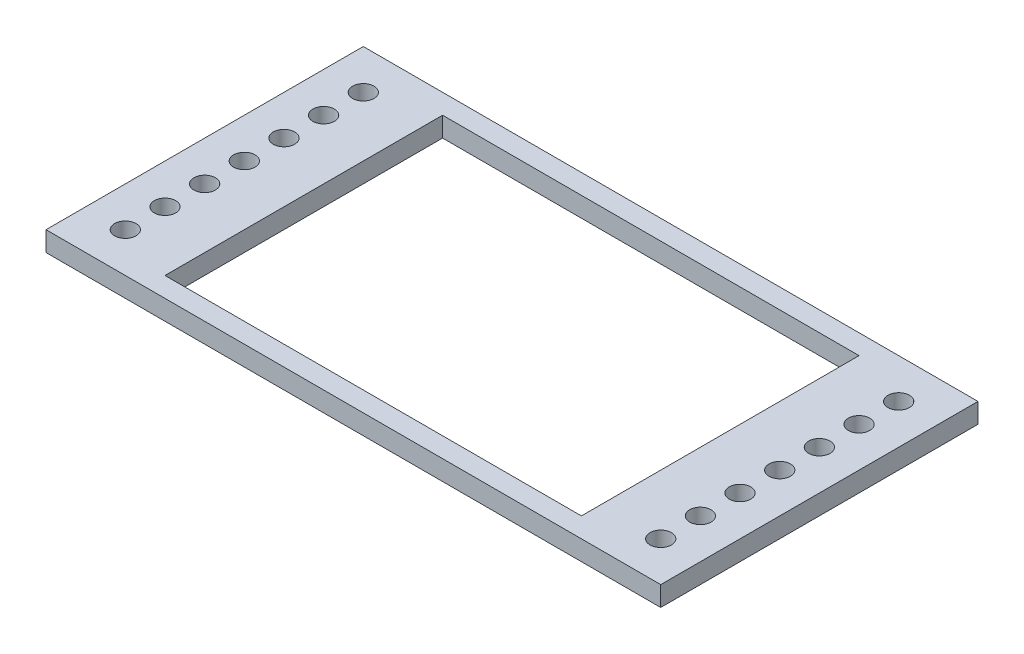
ISO-10303-21;
HEADER;
FILE_DESCRIPTION(('STEP AP214'),'2;1');
FILE_NAME('part.step','',(''),(''),'','','');
FILE_SCHEMA(('AUTOMOTIVE_DESIGN { 1 0 10303 214 1 1 1 1 }'));
ENDSEC;
DATA;
#1=APPLICATION_CONTEXT('core data for automotive mechanical design processes');
#2=APPLICATION_PROTOCOL_DEFINITION('international standard','automotive_design',2000,#1);
#3=PRODUCT_CONTEXT('',#1,'mechanical');
#4=PRODUCT('Part','Part','',(#3));
#5=PRODUCT_RELATED_PRODUCT_CATEGORY('part','',(#4));
#6=PRODUCT_DEFINITION_FORMATION('','',#4);
#7=PRODUCT_DEFINITION_CONTEXT('part definition',#1,'design');
#8=PRODUCT_DEFINITION('design','',#6,#7);
#9=PRODUCT_DEFINITION_SHAPE('','',#8);
#10=(LENGTH_UNIT() NAMED_UNIT(*) SI_UNIT(.MILLI.,.METRE.));
#11=(NAMED_UNIT(*) PLANE_ANGLE_UNIT() SI_UNIT($,.RADIAN.));
#12=(NAMED_UNIT(*) SI_UNIT($,.STERADIAN.) SOLID_ANGLE_UNIT());
#13=UNCERTAINTY_MEASURE_WITH_UNIT(LENGTH_MEASURE(1.E-05),#10,'distance_accuracy_value','');
#14=(GEOMETRIC_REPRESENTATION_CONTEXT(3) GLOBAL_UNCERTAINTY_ASSIGNED_CONTEXT((#13)) GLOBAL_UNIT_ASSIGNED_CONTEXT((#10,
#11,#12)) REPRESENTATION_CONTEXT('',''));
#15=CARTESIAN_POINT('',(0.,0.,0.));
#16=DIRECTION('',(0.,0.,1.));
#17=DIRECTION('',(1.,0.,0.));
#18=AXIS2_PLACEMENT_3D('',#15,#16,#17);
#19=CARTESIAN_POINT('',(0.,6.35,0.));
#20=DIRECTION('',(0.,-1.,0.));
#21=DIRECTION('',(0.,0.,-1.));
#22=AXIS2_PLACEMENT_3D('',#19,#20,#21);
#23=PLANE('',#22);
#24=DIRECTION('',(0.,0.,-1.));
#25=VECTOR('',#24,1.);
#26=CARTESIAN_POINT('',(98.425,6.35,50.8));
#27=LINE('',#26,#25);
#28=CARTESIAN_POINT('',(98.425,6.35,50.8));
#29=VERTEX_POINT('',#28);
#30=CARTESIAN_POINT('',(98.425,6.35,-50.8));
#31=VERTEX_POINT('',#30);
#32=EDGE_CURVE('E139',#29,#31,#27,.T.);
#33=ORIENTED_EDGE('',*,*,#32,.T.);
#34=DIRECTION('',(-1.,0.,0.));
#35=VECTOR('',#34,1.);
#36=CARTESIAN_POINT('',(-98.425,6.35,-50.8));
#37=LINE('',#36,#35);
#38=CARTESIAN_POINT('',(-98.425,6.35,-50.8));
#39=VERTEX_POINT('',#38);
#40=EDGE_CURVE('E142',#31,#39,#37,.T.);
#41=ORIENTED_EDGE('',*,*,#40,.T.);
#42=DIRECTION('',(0.,0.,1.));
#43=VECTOR('',#42,1.);
#44=CARTESIAN_POINT('',(-98.425,6.35,50.8));
#45=LINE('',#44,#43);
#46=CARTESIAN_POINT('',(-98.425,6.35,50.8));
#47=VERTEX_POINT('',#46);
#48=EDGE_CURVE('E145',#39,#47,#45,.T.);
#49=ORIENTED_EDGE('',*,*,#48,.T.);
#50=DIRECTION('',(1.,0.,0.));
#51=VECTOR('',#50,1.);
#52=CARTESIAN_POINT('',(-98.425,6.35,50.8));
#53=LINE('',#52,#51);
#54=EDGE_CURVE('E147',#47,#29,#53,.T.);
#55=ORIENTED_EDGE('',*,*,#54,.T.);
#56=EDGE_LOOP('',(#33,#41,#49,#55));
#57=FACE_BOUND('',#56,.T.);
#58=DIRECTION('',(0.,0.,-1.));
#59=VECTOR('',#58,1.);
#60=CARTESIAN_POINT('',(66.675,6.35,44.45));
#61=LINE('',#60,#59);
#62=CARTESIAN_POINT('',(66.675,6.35,44.45));
#63=VERTEX_POINT('',#62);
#64=CARTESIAN_POINT('',(66.675,6.35,-44.45));
#65=VERTEX_POINT('',#64);
#66=EDGE_CURVE('E100',#63,#65,#61,.T.);
#67=ORIENTED_EDGE('',*,*,#66,.F.);
#68=DIRECTION('',(1.,0.,0.));
#69=VECTOR('',#68,1.);
#70=CARTESIAN_POINT('',(-66.675,6.35,44.45));
#71=LINE('',#70,#69);
#72=CARTESIAN_POINT('',(-66.675,6.35,44.45));
#73=VERTEX_POINT('',#72);
#74=EDGE_CURVE('E123',#73,#63,#71,.T.);
#75=ORIENTED_EDGE('',*,*,#74,.F.);
#76=DIRECTION('',(0.,0.,1.));
#77=VECTOR('',#76,1.);
#78=CARTESIAN_POINT('',(-66.675,6.35,44.45));
#79=LINE('',#78,#77);
#80=CARTESIAN_POINT('',(-66.675,6.35,-44.45));
#81=VERTEX_POINT('',#80);
#82=EDGE_CURVE('E121',#81,#73,#79,.T.);
#83=ORIENTED_EDGE('',*,*,#82,.F.);
#84=DIRECTION('',(-1.,0.,0.));
#85=VECTOR('',#84,1.);
#86=CARTESIAN_POINT('',(-66.675,6.35,-44.45));
#87=LINE('',#86,#85);
#88=EDGE_CURVE('E108',#65,#81,#87,.T.);
#89=ORIENTED_EDGE('',*,*,#88,.F.);
#90=EDGE_LOOP('',(#67,#75,#83,#89));
#91=FACE_BOUND('',#90,.T.);
#92=CARTESIAN_POINT('',(-85.725,6.35,-38.1));
#93=DIRECTION('',(0.,1.,0.));
#94=DIRECTION('',(0.,0.,1.));
#95=AXIS2_PLACEMENT_3D('',#92,#93,#94);
#96=CIRCLE('',#95,3.429);
#97=CARTESIAN_POINT('',(-85.725,6.35,-34.671));
#98=VERTEX_POINT('',#97);
#99=EDGE_CURVE('E129',#98,#98,#96,.T.);
#100=ORIENTED_EDGE('',*,*,#99,.F.);
#101=EDGE_LOOP('',(#100));
#102=FACE_BOUND('',#101,.T.);
#103=CARTESIAN_POINT('',(85.725,6.35,-38.1));
#104=DIRECTION('',(0.,1.,0.));
#105=DIRECTION('',(0.,0.,1.));
#106=AXIS2_PLACEMENT_3D('',#103,#104,#105);
#107=CIRCLE('',#106,3.429);
#108=CARTESIAN_POINT('',(85.725,6.35,-34.671));
#109=VERTEX_POINT('',#108);
#110=EDGE_CURVE('E351',#109,#109,#107,.T.);
#111=ORIENTED_EDGE('',*,*,#110,.F.);
#112=EDGE_LOOP('',(#111));
#113=FACE_BOUND('',#112,.T.);
#114=CARTESIAN_POINT('',(85.7250000000001,6.35,-25.4));
#115=DIRECTION('',(0.,1.,0.));
#116=DIRECTION('',(0.,0.,1.));
#117=AXIS2_PLACEMENT_3D('',#114,#115,#116);
#118=CIRCLE('',#117,3.429);
#119=CARTESIAN_POINT('',(85.7250000000001,6.35,-21.971));
#120=VERTEX_POINT('',#119);
#121=EDGE_CURVE('E345',#120,#120,#118,.T.);
#122=ORIENTED_EDGE('',*,*,#121,.F.);
#123=EDGE_LOOP('',(#122));
#124=FACE_BOUND('',#123,.T.);
#125=CARTESIAN_POINT('',(85.7250000000003,6.35,-12.7));
#126=DIRECTION('',(0.,1.,0.));
#127=DIRECTION('',(0.,0.,1.));
#128=AXIS2_PLACEMENT_3D('',#125,#126,#127);
#129=CIRCLE('',#128,3.429);
#130=CARTESIAN_POINT('',(85.7250000000003,6.35,-9.27100000000001));
#131=VERTEX_POINT('',#130);
#132=EDGE_CURVE('E339',#131,#131,#129,.T.);
#133=ORIENTED_EDGE('',*,*,#132,.F.);
#134=EDGE_LOOP('',(#133));
#135=FACE_BOUND('',#134,.T.);
#136=CARTESIAN_POINT('',(85.7250000000004,6.35,0.));
#137=DIRECTION('',(0.,1.,0.));
#138=DIRECTION('',(0.,0.,1.));
#139=AXIS2_PLACEMENT_3D('',#136,#137,#138);
#140=CIRCLE('',#139,3.429);
#141=CARTESIAN_POINT('',(85.7250000000004,6.35,3.42899999999999));
#142=VERTEX_POINT('',#141);
#143=EDGE_CURVE('E333',#142,#142,#140,.T.);
#144=ORIENTED_EDGE('',*,*,#143,.F.);
#145=EDGE_LOOP('',(#144));
#146=FACE_BOUND('',#145,.T.);
#147=CARTESIAN_POINT('',(85.7250000000005,6.35,12.7));
#148=DIRECTION('',(0.,1.,0.));
#149=DIRECTION('',(0.,0.,1.));
#150=AXIS2_PLACEMENT_3D('',#147,#148,#149);
#151=CIRCLE('',#150,3.429);
#152=CARTESIAN_POINT('',(85.7250000000005,6.35,16.129));
#153=VERTEX_POINT('',#152);
#154=EDGE_CURVE('E327',#153,#153,#151,.T.);
#155=ORIENTED_EDGE('',*,*,#154,.F.);
#156=EDGE_LOOP('',(#155));
#157=FACE_BOUND('',#156,.T.);
#158=CARTESIAN_POINT('',(85.7250000000006,6.35,25.4));
#159=DIRECTION('',(0.,1.,0.));
#160=DIRECTION('',(0.,0.,1.));
#161=AXIS2_PLACEMENT_3D('',#158,#159,#160);
#162=CIRCLE('',#161,3.429);
#163=CARTESIAN_POINT('',(85.7250000000006,6.35,28.829));
#164=VERTEX_POINT('',#163);
#165=EDGE_CURVE('E321',#164,#164,#162,.T.);
#166=ORIENTED_EDGE('',*,*,#165,.F.);
#167=EDGE_LOOP('',(#166));
#168=FACE_BOUND('',#167,.T.);
#169=CARTESIAN_POINT('',(85.7250000000008,6.35,38.1));
#170=DIRECTION('',(0.,1.,0.));
#171=DIRECTION('',(0.,0.,1.));
#172=AXIS2_PLACEMENT_3D('',#169,#170,#171);
#173=CIRCLE('',#172,3.429);
#174=CARTESIAN_POINT('',(85.7250000000008,6.35,41.529));
#175=VERTEX_POINT('',#174);
#176=EDGE_CURVE('E315',#175,#175,#173,.T.);
#177=ORIENTED_EDGE('',*,*,#176,.F.);
#178=EDGE_LOOP('',(#177));
#179=FACE_BOUND('',#178,.T.);
#180=CARTESIAN_POINT('',(-85.7249999999999,6.35,-25.4));
#181=DIRECTION('',(0.,1.,0.));
#182=DIRECTION('',(0.,0.,1.));
#183=AXIS2_PLACEMENT_3D('',#180,#181,#182);
#184=CIRCLE('',#183,3.429);
#185=CARTESIAN_POINT('',(-85.7249999999999,6.35,-21.971));
#186=VERTEX_POINT('',#185);
#187=EDGE_CURVE('E309',#186,#186,#184,.T.);
#188=ORIENTED_EDGE('',*,*,#187,.F.);
#189=EDGE_LOOP('',(#188));
#190=FACE_BOUND('',#189,.T.);
#191=CARTESIAN_POINT('',(-85.7249999999998,6.35,-12.7));
#192=DIRECTION('',(0.,1.,0.));
#193=DIRECTION('',(0.,0.,1.));
#194=AXIS2_PLACEMENT_3D('',#191,#192,#193);
#195=CIRCLE('',#194,3.429);
#196=CARTESIAN_POINT('',(-85.7249999999998,6.35,-9.27100000000001));
#197=VERTEX_POINT('',#196);
#198=EDGE_CURVE('E303',#197,#197,#195,.T.);
#199=ORIENTED_EDGE('',*,*,#198,.F.);
#200=EDGE_LOOP('',(#199));
#201=FACE_BOUND('',#200,.T.);
#202=CARTESIAN_POINT('',(-85.7249999999996,6.35,0.));
#203=DIRECTION('',(0.,1.,0.));
#204=DIRECTION('',(0.,0.,1.));
#205=AXIS2_PLACEMENT_3D('',#202,#203,#204);
#206=CIRCLE('',#205,3.429);
#207=CARTESIAN_POINT('',(-85.7249999999996,6.35,3.42899999999999));
#208=VERTEX_POINT('',#207);
#209=EDGE_CURVE('E297',#208,#208,#206,.T.);
#210=ORIENTED_EDGE('',*,*,#209,.F.);
#211=EDGE_LOOP('',(#210));
#212=FACE_BOUND('',#211,.T.);
#213=CARTESIAN_POINT('',(-85.7249999999995,6.35,12.7));
#214=DIRECTION('',(0.,1.,0.));
#215=DIRECTION('',(0.,0.,1.));
#216=AXIS2_PLACEMENT_3D('',#213,#214,#215);
#217=CIRCLE('',#216,3.429);
#218=CARTESIAN_POINT('',(-85.7249999999995,6.35,16.129));
#219=VERTEX_POINT('',#218);
#220=EDGE_CURVE('E291',#219,#219,#217,.T.);
#221=ORIENTED_EDGE('',*,*,#220,.F.);
#222=EDGE_LOOP('',(#221));
#223=FACE_BOUND('',#222,.T.);
#224=CARTESIAN_POINT('',(-85.7249999999993,6.35,25.4));
#225=DIRECTION('',(0.,1.,0.));
#226=DIRECTION('',(0.,0.,1.));
#227=AXIS2_PLACEMENT_3D('',#224,#225,#226);
#228=CIRCLE('',#227,3.429);
#229=CARTESIAN_POINT('',(-85.7249999999993,6.35,28.829));
#230=VERTEX_POINT('',#229);
#231=EDGE_CURVE('E285',#230,#230,#228,.T.);
#232=ORIENTED_EDGE('',*,*,#231,.F.);
#233=EDGE_LOOP('',(#232));
#234=FACE_BOUND('',#233,.T.);
#235=CARTESIAN_POINT('',(-85.7249999999992,6.35,38.1));
#236=DIRECTION('',(0.,1.,0.));
#237=DIRECTION('',(0.,0.,1.));
#238=AXIS2_PLACEMENT_3D('',#235,#236,#237);
#239=CIRCLE('',#238,3.429);
#240=CARTESIAN_POINT('',(-85.7249999999992,6.35,41.529));
#241=VERTEX_POINT('',#240);
#242=EDGE_CURVE('E276',#241,#241,#239,.T.);
#243=ORIENTED_EDGE('',*,*,#242,.F.);
#244=EDGE_LOOP('',(#243));
#245=FACE_BOUND('',#244,.T.);
#246=ADVANCED_FACE('F35',(#57,#91,#102,#113,#124,#135,#146,#157,#168,#179,#190,#201,#212,#223,
#234,#245),#23,.F.);
#247=CARTESIAN_POINT('',(0.,0.,0.));
#248=DIRECTION('',(0.,-1.,0.));
#249=DIRECTION('',(0.,0.,-1.));
#250=AXIS2_PLACEMENT_3D('',#247,#248,#249);
#251=PLANE('',#250);
#252=CARTESIAN_POINT('',(-85.7249999999993,0.,25.4));
#253=DIRECTION('',(0.,1.,0.));
#254=DIRECTION('',(0.,0.,1.));
#255=AXIS2_PLACEMENT_3D('',#252,#253,#254);
#256=CIRCLE('',#255,3.429);
#257=CARTESIAN_POINT('',(-85.7249999999993,0.,28.829));
#258=VERTEX_POINT('',#257);
#259=EDGE_CURVE('E282',#258,#258,#256,.T.);
#260=ORIENTED_EDGE('',*,*,#259,.T.);
#261=EDGE_LOOP('',(#260));
#262=FACE_BOUND('',#261,.T.);
#263=CARTESIAN_POINT('',(-85.7249999999996,0.,0.));
#264=DIRECTION('',(0.,1.,0.));
#265=DIRECTION('',(0.,0.,1.));
#266=AXIS2_PLACEMENT_3D('',#263,#264,#265);
#267=CIRCLE('',#266,3.429);
#268=CARTESIAN_POINT('',(-85.7249999999996,0.,3.42899999999999));
#269=VERTEX_POINT('',#268);
#270=EDGE_CURVE('E294',#269,#269,#267,.T.);
#271=ORIENTED_EDGE('',*,*,#270,.T.);
#272=EDGE_LOOP('',(#271));
#273=FACE_BOUND('',#272,.T.);
#274=CARTESIAN_POINT('',(-85.7249999999999,0.,-25.4));
#275=DIRECTION('',(0.,1.,0.));
#276=DIRECTION('',(0.,0.,1.));
#277=AXIS2_PLACEMENT_3D('',#274,#275,#276);
#278=CIRCLE('',#277,3.429);
#279=CARTESIAN_POINT('',(-85.7249999999999,0.,-21.971));
#280=VERTEX_POINT('',#279);
#281=EDGE_CURVE('E306',#280,#280,#278,.T.);
#282=ORIENTED_EDGE('',*,*,#281,.T.);
#283=EDGE_LOOP('',(#282));
#284=FACE_BOUND('',#283,.T.);
#285=CARTESIAN_POINT('',(85.7250000000006,0.,25.4));
#286=DIRECTION('',(0.,1.,0.));
#287=DIRECTION('',(0.,0.,1.));
#288=AXIS2_PLACEMENT_3D('',#285,#286,#287);
#289=CIRCLE('',#288,3.429);
#290=CARTESIAN_POINT('',(85.7250000000006,0.,28.829));
#291=VERTEX_POINT('',#290);
#292=EDGE_CURVE('E318',#291,#291,#289,.T.);
#293=ORIENTED_EDGE('',*,*,#292,.T.);
#294=EDGE_LOOP('',(#293));
#295=FACE_BOUND('',#294,.T.);
#296=CARTESIAN_POINT('',(85.7250000000004,0.,0.));
#297=DIRECTION('',(0.,1.,0.));
#298=DIRECTION('',(0.,0.,1.));
#299=AXIS2_PLACEMENT_3D('',#296,#297,#298);
#300=CIRCLE('',#299,3.429);
#301=CARTESIAN_POINT('',(85.7250000000004,0.,3.42899999999999));
#302=VERTEX_POINT('',#301);
#303=EDGE_CURVE('E330',#302,#302,#300,.T.);
#304=ORIENTED_EDGE('',*,*,#303,.T.);
#305=EDGE_LOOP('',(#304));
#306=FACE_BOUND('',#305,.T.);
#307=CARTESIAN_POINT('',(85.7250000000001,0.,-25.4));
#308=DIRECTION('',(0.,1.,0.));
#309=DIRECTION('',(0.,0.,1.));
#310=AXIS2_PLACEMENT_3D('',#307,#308,#309);
#311=CIRCLE('',#310,3.429);
#312=CARTESIAN_POINT('',(85.7250000000001,0.,-21.971));
#313=VERTEX_POINT('',#312);
#314=EDGE_CURVE('E342',#313,#313,#311,.T.);
#315=ORIENTED_EDGE('',*,*,#314,.T.);
#316=EDGE_LOOP('',(#315));
#317=FACE_BOUND('',#316,.T.);
#318=CARTESIAN_POINT('',(-85.725,0.,-38.1));
#319=DIRECTION('',(0.,1.,0.));
#320=DIRECTION('',(0.,0.,1.));
#321=AXIS2_PLACEMENT_3D('',#318,#319,#320);
#322=CIRCLE('',#321,3.429);
#323=CARTESIAN_POINT('',(-85.725,0.,-34.671));
#324=VERTEX_POINT('',#323);
#325=EDGE_CURVE('E354',#324,#324,#322,.T.);
#326=ORIENTED_EDGE('',*,*,#325,.T.);
#327=EDGE_LOOP('',(#326));
#328=FACE_BOUND('',#327,.T.);
#329=DIRECTION('',(0.,0.,-1.));
#330=VECTOR('',#329,1.);
#331=CARTESIAN_POINT('',(98.425,0.,50.8));
#332=LINE('',#331,#330);
#333=CARTESIAN_POINT('',(98.425,0.,50.8));
#334=VERTEX_POINT('',#333);
#335=CARTESIAN_POINT('',(98.425,0.,-50.8));
#336=VERTEX_POINT('',#335);
#337=EDGE_CURVE('E116',#334,#336,#332,.T.);
#338=ORIENTED_EDGE('',*,*,#337,.F.);
#339=DIRECTION('',(1.,0.,0.));
#340=VECTOR('',#339,1.);
#341=CARTESIAN_POINT('',(-98.425,0.,50.8));
#342=LINE('',#341,#340);
#343=CARTESIAN_POINT('',(-98.425,0.,50.8));
#344=VERTEX_POINT('',#343);
#345=EDGE_CURVE('E143',#344,#334,#342,.T.);
#346=ORIENTED_EDGE('',*,*,#345,.F.);
#347=DIRECTION('',(0.,0.,1.));
#348=VECTOR('',#347,1.);
#349=CARTESIAN_POINT('',(-98.425,0.,50.8));
#350=LINE('',#349,#348);
#351=CARTESIAN_POINT('',(-98.425,0.,-50.8));
#352=VERTEX_POINT('',#351);
#353=EDGE_CURVE('E154',#352,#344,#350,.T.);
#354=ORIENTED_EDGE('',*,*,#353,.F.);
#355=DIRECTION('',(-1.,0.,0.));
#356=VECTOR('',#355,1.);
#357=CARTESIAN_POINT('',(-98.425,0.,-50.8));
#358=LINE('',#357,#356);
#359=EDGE_CURVE('E152',#336,#352,#358,.T.);
#360=ORIENTED_EDGE('',*,*,#359,.F.);
#361=EDGE_LOOP('',(#338,#346,#354,#360));
#362=FACE_BOUND('',#361,.T.);
#363=DIRECTION('',(1.,0.,0.));
#364=VECTOR('',#363,1.);
#365=CARTESIAN_POINT('',(-66.675,0.,44.45));
#366=LINE('',#365,#364);
#367=CARTESIAN_POINT('',(-66.675,0.,44.45));
#368=VERTEX_POINT('',#367);
#369=CARTESIAN_POINT('',(66.675,0.,44.45));
#370=VERTEX_POINT('',#369);
#371=EDGE_CURVE('E109',#368,#370,#366,.T.);
#372=ORIENTED_EDGE('',*,*,#371,.T.);
#373=DIRECTION('',(0.,0.,-1.));
#374=VECTOR('',#373,1.);
#375=CARTESIAN_POINT('',(66.675,0.,44.45));
#376=LINE('',#375,#374);
#377=CARTESIAN_POINT('',(66.675,0.,-44.45));
#378=VERTEX_POINT('',#377);
#379=EDGE_CURVE('E58',#370,#378,#376,.T.);
#380=ORIENTED_EDGE('',*,*,#379,.T.);
#381=DIRECTION('',(-1.,0.,0.));
#382=VECTOR('',#381,1.);
#383=CARTESIAN_POINT('',(-66.675,0.,-44.45));
#384=LINE('',#383,#382);
#385=CARTESIAN_POINT('',(-66.675,0.,-44.45));
#386=VERTEX_POINT('',#385);
#387=EDGE_CURVE('E115',#378,#386,#384,.T.);
#388=ORIENTED_EDGE('',*,*,#387,.T.);
#389=DIRECTION('',(0.,0.,1.));
#390=VECTOR('',#389,1.);
#391=CARTESIAN_POINT('',(-66.675,0.,44.45));
#392=LINE('',#391,#390);
#393=EDGE_CURVE('E131',#386,#368,#392,.T.);
#394=ORIENTED_EDGE('',*,*,#393,.T.);
#395=EDGE_LOOP('',(#372,#380,#388,#394));
#396=FACE_BOUND('',#395,.T.);
#397=CARTESIAN_POINT('',(85.725,0.,-38.1));
#398=DIRECTION('',(0.,1.,0.));
#399=DIRECTION('',(0.,0.,1.));
#400=AXIS2_PLACEMENT_3D('',#397,#398,#399);
#401=CIRCLE('',#400,3.429);
#402=CARTESIAN_POINT('',(85.725,0.,-34.671));
#403=VERTEX_POINT('',#402);
#404=EDGE_CURVE('E348',#403,#403,#401,.T.);
#405=ORIENTED_EDGE('',*,*,#404,.T.);
#406=EDGE_LOOP('',(#405));
#407=FACE_BOUND('',#406,.T.);
#408=CARTESIAN_POINT('',(85.7250000000003,0.,-12.7));
#409=DIRECTION('',(0.,1.,0.));
#410=DIRECTION('',(0.,0.,1.));
#411=AXIS2_PLACEMENT_3D('',#408,#409,#410);
#412=CIRCLE('',#411,3.429);
#413=CARTESIAN_POINT('',(85.7250000000003,0.,-9.27100000000001));
#414=VERTEX_POINT('',#413);
#415=EDGE_CURVE('E336',#414,#414,#412,.T.);
#416=ORIENTED_EDGE('',*,*,#415,.T.);
#417=EDGE_LOOP('',(#416));
#418=FACE_BOUND('',#417,.T.);
#419=CARTESIAN_POINT('',(85.7250000000005,0.,12.7));
#420=DIRECTION('',(0.,1.,0.));
#421=DIRECTION('',(0.,0.,1.));
#422=AXIS2_PLACEMENT_3D('',#419,#420,#421);
#423=CIRCLE('',#422,3.429);
#424=CARTESIAN_POINT('',(85.7250000000005,0.,16.129));
#425=VERTEX_POINT('',#424);
#426=EDGE_CURVE('E324',#425,#425,#423,.T.);
#427=ORIENTED_EDGE('',*,*,#426,.T.);
#428=EDGE_LOOP('',(#427));
#429=FACE_BOUND('',#428,.T.);
#430=CARTESIAN_POINT('',(85.7250000000008,0.,38.1));
#431=DIRECTION('',(0.,1.,0.));
#432=DIRECTION('',(0.,0.,1.));
#433=AXIS2_PLACEMENT_3D('',#430,#431,#432);
#434=CIRCLE('',#433,3.429);
#435=CARTESIAN_POINT('',(85.7250000000008,0.,41.529));
#436=VERTEX_POINT('',#435);
#437=EDGE_CURVE('E312',#436,#436,#434,.T.);
#438=ORIENTED_EDGE('',*,*,#437,.T.);
#439=EDGE_LOOP('',(#438));
#440=FACE_BOUND('',#439,.T.);
#441=CARTESIAN_POINT('',(-85.7249999999998,0.,-12.7));
#442=DIRECTION('',(0.,1.,0.));
#443=DIRECTION('',(0.,0.,1.));
#444=AXIS2_PLACEMENT_3D('',#441,#442,#443);
#445=CIRCLE('',#444,3.429);
#446=CARTESIAN_POINT('',(-85.7249999999998,0.,-9.27100000000001));
#447=VERTEX_POINT('',#446);
#448=EDGE_CURVE('E300',#447,#447,#445,.T.);
#449=ORIENTED_EDGE('',*,*,#448,.T.);
#450=EDGE_LOOP('',(#449));
#451=FACE_BOUND('',#450,.T.);
#452=CARTESIAN_POINT('',(-85.7249999999995,0.,12.7));
#453=DIRECTION('',(0.,1.,0.));
#454=DIRECTION('',(0.,0.,1.));
#455=AXIS2_PLACEMENT_3D('',#452,#453,#454);
#456=CIRCLE('',#455,3.429);
#457=CARTESIAN_POINT('',(-85.7249999999995,0.,16.129));
#458=VERTEX_POINT('',#457);
#459=EDGE_CURVE('E288',#458,#458,#456,.T.);
#460=ORIENTED_EDGE('',*,*,#459,.T.);
#461=EDGE_LOOP('',(#460));
#462=FACE_BOUND('',#461,.T.);
#463=CARTESIAN_POINT('',(-85.7249999999992,0.,38.1));
#464=DIRECTION('',(0.,1.,0.));
#465=DIRECTION('',(0.,0.,1.));
#466=AXIS2_PLACEMENT_3D('',#463,#464,#465);
#467=CIRCLE('',#466,3.429);
#468=CARTESIAN_POINT('',(-85.7249999999992,0.,41.529));
#469=VERTEX_POINT('',#468);
#470=EDGE_CURVE('E279',#469,#469,#467,.T.);
#471=ORIENTED_EDGE('',*,*,#470,.T.);
#472=EDGE_LOOP('',(#471));
#473=FACE_BOUND('',#472,.T.);
#474=ADVANCED_FACE('F172',(#262,#273,#284,#295,#306,#317,#328,#362,#396,#407,#418,#429,#440,
#451,#462,#473),#251,.T.);
#475=CARTESIAN_POINT('',(98.425,6.35,50.8));
#476=DIRECTION('',(-1.,0.,0.));
#477=DIRECTION('',(0.,0.,1.));
#478=AXIS2_PLACEMENT_3D('',#475,#476,#477);
#479=PLANE('',#478);
#480=ORIENTED_EDGE('',*,*,#337,.T.);
#481=DIRECTION('',(0.,-1.,0.));
#482=VECTOR('',#481,1.);
#483=CARTESIAN_POINT('',(98.425,6.35,-50.8));
#484=LINE('',#483,#482);
#485=EDGE_CURVE('E11',#31,#336,#484,.T.);
#486=ORIENTED_EDGE('',*,*,#485,.F.);
#487=ORIENTED_EDGE('',*,*,#32,.F.);
#488=DIRECTION('',(0.,-1.,0.));
#489=VECTOR('',#488,1.);
#490=CARTESIAN_POINT('',(98.425,6.35,50.8));
#491=LINE('',#490,#489);
#492=EDGE_CURVE('E149',#29,#334,#491,.T.);
#493=ORIENTED_EDGE('',*,*,#492,.T.);
#494=EDGE_LOOP('',(#480,#486,#487,#493));
#495=FACE_BOUND('',#494,.T.);
#496=ADVANCED_FACE('F37',(#495),#479,.F.);
#497=CARTESIAN_POINT('',(-98.425,6.35,-50.8));
#498=DIRECTION('',(0.,0.,1.));
#499=DIRECTION('',(1.,0.,0.));
#500=AXIS2_PLACEMENT_3D('',#497,#498,#499);
#501=PLANE('',#500);
#502=ORIENTED_EDGE('',*,*,#359,.T.);
#503=DIRECTION('',(0.,-1.,0.));
#504=VECTOR('',#503,1.);
#505=CARTESIAN_POINT('',(-98.425,6.35,-50.8));
#506=LINE('',#505,#504);
#507=EDGE_CURVE('E43',#39,#352,#506,.T.);
#508=ORIENTED_EDGE('',*,*,#507,.F.);
#509=ORIENTED_EDGE('',*,*,#40,.F.);
#510=ORIENTED_EDGE('',*,*,#485,.T.);
#511=EDGE_LOOP('',(#502,#508,#509,#510));
#512=FACE_BOUND('',#511,.T.);
#513=ADVANCED_FACE('F182',(#512),#501,.F.);
#514=CARTESIAN_POINT('',(-98.425,6.35,50.8));
#515=DIRECTION('',(1.,0.,0.));
#516=DIRECTION('',(0.,0.,-1.));
#517=AXIS2_PLACEMENT_3D('',#514,#515,#516);
#518=PLANE('',#517);
#519=ORIENTED_EDGE('',*,*,#353,.T.);
#520=DIRECTION('',(0.,-1.,0.));
#521=VECTOR('',#520,1.);
#522=CARTESIAN_POINT('',(-98.425,6.35,50.8));
#523=LINE('',#522,#521);
#524=EDGE_CURVE('E159',#47,#344,#523,.T.);
#525=ORIENTED_EDGE('',*,*,#524,.F.);
#526=ORIENTED_EDGE('',*,*,#48,.F.);
#527=ORIENTED_EDGE('',*,*,#507,.T.);
#528=EDGE_LOOP('',(#519,#525,#526,#527));
#529=FACE_BOUND('',#528,.T.);
#530=ADVANCED_FACE('F166',(#529),#518,.F.);
#531=CARTESIAN_POINT('',(-98.425,6.35,50.8));
#532=DIRECTION('',(0.,0.,-1.));
#533=DIRECTION('',(-1.,0.,0.));
#534=AXIS2_PLACEMENT_3D('',#531,#532,#533);
#535=PLANE('',#534);
#536=ORIENTED_EDGE('',*,*,#345,.T.);
#537=ORIENTED_EDGE('',*,*,#492,.F.);
#538=ORIENTED_EDGE('',*,*,#54,.F.);
#539=ORIENTED_EDGE('',*,*,#524,.T.);
#540=EDGE_LOOP('',(#536,#537,#538,#539));
#541=FACE_BOUND('',#540,.T.);
#542=ADVANCED_FACE('F176',(#541),#535,.F.);
#543=CARTESIAN_POINT('',(66.675,6.35,44.45));
#544=DIRECTION('',(-1.,0.,0.));
#545=DIRECTION('',(0.,0.,1.));
#546=AXIS2_PLACEMENT_3D('',#543,#544,#545);
#547=PLANE('',#546);
#548=ORIENTED_EDGE('',*,*,#379,.F.);
#549=DIRECTION('',(0.,-1.,0.));
#550=VECTOR('',#549,1.);
#551=CARTESIAN_POINT('',(66.675,6.35,44.45));
#552=LINE('',#551,#550);
#553=EDGE_CURVE('E104',#63,#370,#552,.T.);
#554=ORIENTED_EDGE('',*,*,#553,.F.);
#555=ORIENTED_EDGE('',*,*,#66,.T.);
#556=DIRECTION('',(0.,-1.,0.));
#557=VECTOR('',#556,1.);
#558=CARTESIAN_POINT('',(66.675,6.35,-44.45));
#559=LINE('',#558,#557);
#560=EDGE_CURVE('E103',#65,#378,#559,.T.);
#561=ORIENTED_EDGE('',*,*,#560,.T.);
#562=EDGE_LOOP('',(#548,#554,#555,#561));
#563=FACE_BOUND('',#562,.T.);
#564=ADVANCED_FACE('F102',(#563),#547,.T.);
#565=CARTESIAN_POINT('',(-66.675,6.35,-44.45));
#566=DIRECTION('',(0.,0.,1.));
#567=DIRECTION('',(1.,0.,0.));
#568=AXIS2_PLACEMENT_3D('',#565,#566,#567);
#569=PLANE('',#568);
#570=ORIENTED_EDGE('',*,*,#387,.F.);
#571=ORIENTED_EDGE('',*,*,#560,.F.);
#572=ORIENTED_EDGE('',*,*,#88,.T.);
#573=DIRECTION('',(0.,-1.,0.));
#574=VECTOR('',#573,1.);
#575=CARTESIAN_POINT('',(-66.675,6.35,-44.45));
#576=LINE('',#575,#574);
#577=EDGE_CURVE('E117',#81,#386,#576,.T.);
#578=ORIENTED_EDGE('',*,*,#577,.T.);
#579=EDGE_LOOP('',(#570,#571,#572,#578));
#580=FACE_BOUND('',#579,.T.);
#581=ADVANCED_FACE('F112',(#580),#569,.T.);
#582=CARTESIAN_POINT('',(-66.675,6.35,44.45));
#583=DIRECTION('',(1.,0.,0.));
#584=DIRECTION('',(0.,0.,-1.));
#585=AXIS2_PLACEMENT_3D('',#582,#583,#584);
#586=PLANE('',#585);
#587=ORIENTED_EDGE('',*,*,#393,.F.);
#588=ORIENTED_EDGE('',*,*,#577,.F.);
#589=ORIENTED_EDGE('',*,*,#82,.T.);
#590=DIRECTION('',(0.,-1.,0.));
#591=VECTOR('',#590,1.);
#592=CARTESIAN_POINT('',(-66.675,6.35,44.45));
#593=LINE('',#592,#591);
#594=EDGE_CURVE('E50',#73,#368,#593,.T.);
#595=ORIENTED_EDGE('',*,*,#594,.T.);
#596=EDGE_LOOP('',(#587,#588,#589,#595));
#597=FACE_BOUND('',#596,.T.);
#598=ADVANCED_FACE('F206',(#597),#586,.T.);
#599=CARTESIAN_POINT('',(-66.675,6.35,44.45));
#600=DIRECTION('',(0.,0.,-1.));
#601=DIRECTION('',(-1.,0.,0.));
#602=AXIS2_PLACEMENT_3D('',#599,#600,#601);
#603=PLANE('',#602);
#604=ORIENTED_EDGE('',*,*,#371,.F.);
#605=ORIENTED_EDGE('',*,*,#594,.F.);
#606=ORIENTED_EDGE('',*,*,#74,.T.);
#607=ORIENTED_EDGE('',*,*,#553,.T.);
#608=EDGE_LOOP('',(#604,#605,#606,#607));
#609=FACE_BOUND('',#608,.T.);
#610=ADVANCED_FACE('F210',(#609),#603,.T.);
#611=CARTESIAN_POINT('',(-85.725,6.35,-38.1));
#612=DIRECTION('',(0.,-1.,0.));
#613=DIRECTION('',(0.,0.,-1.));
#614=AXIS2_PLACEMENT_3D('',#611,#612,#613);
#615=CYLINDRICAL_SURFACE('',#614,3.429);
#616=ORIENTED_EDGE('',*,*,#99,.T.);
#617=EDGE_LOOP('',(#616));
#618=FACE_BOUND('',#617,.T.);
#619=ORIENTED_EDGE('',*,*,#325,.F.);
#620=EDGE_LOOP('',(#619));
#621=FACE_BOUND('',#620,.T.);
#622=ADVANCED_FACE('F216',(#618,#621),#615,.F.);
#623=CARTESIAN_POINT('',(85.725,6.35,-38.1));
#624=DIRECTION('',(0.,-1.,0.));
#625=DIRECTION('',(0.,0.,-1.));
#626=AXIS2_PLACEMENT_3D('',#623,#624,#625);
#627=CYLINDRICAL_SURFACE('',#626,3.429);
#628=ORIENTED_EDGE('',*,*,#110,.T.);
#629=EDGE_LOOP('',(#628));
#630=FACE_BOUND('',#629,.T.);
#631=ORIENTED_EDGE('',*,*,#404,.F.);
#632=EDGE_LOOP('',(#631));
#633=FACE_BOUND('',#632,.T.);
#634=ADVANCED_FACE('F219',(#630,#633),#627,.F.);
#635=CARTESIAN_POINT('',(85.7250000000001,6.35,-25.4));
#636=DIRECTION('',(0.,-1.,0.));
#637=DIRECTION('',(0.,0.,-1.));
#638=AXIS2_PLACEMENT_3D('',#635,#636,#637);
#639=CYLINDRICAL_SURFACE('',#638,3.429);
#640=ORIENTED_EDGE('',*,*,#121,.T.);
#641=EDGE_LOOP('',(#640));
#642=FACE_BOUND('',#641,.T.);
#643=ORIENTED_EDGE('',*,*,#314,.F.);
#644=EDGE_LOOP('',(#643));
#645=FACE_BOUND('',#644,.T.);
#646=ADVANCED_FACE('F223',(#642,#645),#639,.F.);
#647=CARTESIAN_POINT('',(85.7250000000003,6.35,-12.7));
#648=DIRECTION('',(0.,-1.,0.));
#649=DIRECTION('',(0.,0.,-1.));
#650=AXIS2_PLACEMENT_3D('',#647,#648,#649);
#651=CYLINDRICAL_SURFACE('',#650,3.429);
#652=ORIENTED_EDGE('',*,*,#132,.T.);
#653=EDGE_LOOP('',(#652));
#654=FACE_BOUND('',#653,.T.);
#655=ORIENTED_EDGE('',*,*,#415,.F.);
#656=EDGE_LOOP('',(#655));
#657=FACE_BOUND('',#656,.T.);
#658=ADVANCED_FACE('F227',(#654,#657),#651,.F.);
#659=CARTESIAN_POINT('',(85.7250000000004,6.35,0.));
#660=DIRECTION('',(0.,-1.,0.));
#661=DIRECTION('',(0.,0.,-1.));
#662=AXIS2_PLACEMENT_3D('',#659,#660,#661);
#663=CYLINDRICAL_SURFACE('',#662,3.429);
#664=ORIENTED_EDGE('',*,*,#143,.T.);
#665=EDGE_LOOP('',(#664));
#666=FACE_BOUND('',#665,.T.);
#667=ORIENTED_EDGE('',*,*,#303,.F.);
#668=EDGE_LOOP('',(#667));
#669=FACE_BOUND('',#668,.T.);
#670=ADVANCED_FACE('F231',(#666,#669),#663,.F.);
#671=CARTESIAN_POINT('',(85.7250000000005,6.35,12.7));
#672=DIRECTION('',(0.,-1.,0.));
#673=DIRECTION('',(0.,0.,-1.));
#674=AXIS2_PLACEMENT_3D('',#671,#672,#673);
#675=CYLINDRICAL_SURFACE('',#674,3.429);
#676=ORIENTED_EDGE('',*,*,#154,.T.);
#677=EDGE_LOOP('',(#676));
#678=FACE_BOUND('',#677,.T.);
#679=ORIENTED_EDGE('',*,*,#426,.F.);
#680=EDGE_LOOP('',(#679));
#681=FACE_BOUND('',#680,.T.);
#682=ADVANCED_FACE('F235',(#678,#681),#675,.F.);
#683=CARTESIAN_POINT('',(85.7250000000006,6.35,25.4));
#684=DIRECTION('',(0.,-1.,0.));
#685=DIRECTION('',(0.,0.,-1.));
#686=AXIS2_PLACEMENT_3D('',#683,#684,#685);
#687=CYLINDRICAL_SURFACE('',#686,3.429);
#688=ORIENTED_EDGE('',*,*,#165,.T.);
#689=EDGE_LOOP('',(#688));
#690=FACE_BOUND('',#689,.T.);
#691=ORIENTED_EDGE('',*,*,#292,.F.);
#692=EDGE_LOOP('',(#691));
#693=FACE_BOUND('',#692,.T.);
#694=ADVANCED_FACE('F239',(#690,#693),#687,.F.);
#695=CARTESIAN_POINT('',(85.7250000000008,6.35,38.1));
#696=DIRECTION('',(0.,-1.,0.));
#697=DIRECTION('',(0.,0.,-1.));
#698=AXIS2_PLACEMENT_3D('',#695,#696,#697);
#699=CYLINDRICAL_SURFACE('',#698,3.429);
#700=ORIENTED_EDGE('',*,*,#176,.T.);
#701=EDGE_LOOP('',(#700));
#702=FACE_BOUND('',#701,.T.);
#703=ORIENTED_EDGE('',*,*,#437,.F.);
#704=EDGE_LOOP('',(#703));
#705=FACE_BOUND('',#704,.T.);
#706=ADVANCED_FACE('F243',(#702,#705),#699,.F.);
#707=CARTESIAN_POINT('',(-85.7249999999999,6.35,-25.4));
#708=DIRECTION('',(0.,-1.,0.));
#709=DIRECTION('',(0.,0.,-1.));
#710=AXIS2_PLACEMENT_3D('',#707,#708,#709);
#711=CYLINDRICAL_SURFACE('',#710,3.429);
#712=ORIENTED_EDGE('',*,*,#187,.T.);
#713=EDGE_LOOP('',(#712));
#714=FACE_BOUND('',#713,.T.);
#715=ORIENTED_EDGE('',*,*,#281,.F.);
#716=EDGE_LOOP('',(#715));
#717=FACE_BOUND('',#716,.T.);
#718=ADVANCED_FACE('F247',(#714,#717),#711,.F.);
#719=CARTESIAN_POINT('',(-85.7249999999998,6.35,-12.7));
#720=DIRECTION('',(0.,-1.,0.));
#721=DIRECTION('',(0.,0.,-1.));
#722=AXIS2_PLACEMENT_3D('',#719,#720,#721);
#723=CYLINDRICAL_SURFACE('',#722,3.429);
#724=ORIENTED_EDGE('',*,*,#198,.T.);
#725=EDGE_LOOP('',(#724));
#726=FACE_BOUND('',#725,.T.);
#727=ORIENTED_EDGE('',*,*,#448,.F.);
#728=EDGE_LOOP('',(#727));
#729=FACE_BOUND('',#728,.T.);
#730=ADVANCED_FACE('F251',(#726,#729),#723,.F.);
#731=CARTESIAN_POINT('',(-85.7249999999996,6.35,0.));
#732=DIRECTION('',(0.,-1.,0.));
#733=DIRECTION('',(0.,0.,-1.));
#734=AXIS2_PLACEMENT_3D('',#731,#732,#733);
#735=CYLINDRICAL_SURFACE('',#734,3.429);
#736=ORIENTED_EDGE('',*,*,#209,.T.);
#737=EDGE_LOOP('',(#736));
#738=FACE_BOUND('',#737,.T.);
#739=ORIENTED_EDGE('',*,*,#270,.F.);
#740=EDGE_LOOP('',(#739));
#741=FACE_BOUND('',#740,.T.);
#742=ADVANCED_FACE('F255',(#738,#741),#735,.F.);
#743=CARTESIAN_POINT('',(-85.7249999999995,6.35,12.7));
#744=DIRECTION('',(0.,-1.,0.));
#745=DIRECTION('',(0.,0.,-1.));
#746=AXIS2_PLACEMENT_3D('',#743,#744,#745);
#747=CYLINDRICAL_SURFACE('',#746,3.429);
#748=ORIENTED_EDGE('',*,*,#220,.T.);
#749=EDGE_LOOP('',(#748));
#750=FACE_BOUND('',#749,.T.);
#751=ORIENTED_EDGE('',*,*,#459,.F.);
#752=EDGE_LOOP('',(#751));
#753=FACE_BOUND('',#752,.T.);
#754=ADVANCED_FACE('F259',(#750,#753),#747,.F.);
#755=CARTESIAN_POINT('',(-85.7249999999993,6.35,25.4));
#756=DIRECTION('',(0.,-1.,0.));
#757=DIRECTION('',(0.,0.,-1.));
#758=AXIS2_PLACEMENT_3D('',#755,#756,#757);
#759=CYLINDRICAL_SURFACE('',#758,3.429);
#760=ORIENTED_EDGE('',*,*,#231,.T.);
#761=EDGE_LOOP('',(#760));
#762=FACE_BOUND('',#761,.T.);
#763=ORIENTED_EDGE('',*,*,#259,.F.);
#764=EDGE_LOOP('',(#763));
#765=FACE_BOUND('',#764,.T.);
#766=ADVANCED_FACE('F263',(#762,#765),#759,.F.);
#767=CARTESIAN_POINT('',(-85.7249999999992,6.35,38.1));
#768=DIRECTION('',(0.,-1.,0.));
#769=DIRECTION('',(0.,0.,-1.));
#770=AXIS2_PLACEMENT_3D('',#767,#768,#769);
#771=CYLINDRICAL_SURFACE('',#770,3.429);
#772=ORIENTED_EDGE('',*,*,#242,.T.);
#773=EDGE_LOOP('',(#772));
#774=FACE_BOUND('',#773,.T.);
#775=ORIENTED_EDGE('',*,*,#470,.F.);
#776=EDGE_LOOP('',(#775));
#777=FACE_BOUND('',#776,.T.);
#778=ADVANCED_FACE('F267',(#774,#777),#771,.F.);
#779=CLOSED_SHELL('',(#246,#474,#496,#513,#530,#542,#564,#581,#598,#610,#622,#634,#646,#658,
#670,#682,#694,#706,#718,#730,#742,#754,#766,#778));
#780=MANIFOLD_SOLID_BREP('B2',#779);
#781=ADVANCED_BREP_SHAPE_REPRESENTATION('',(#18,#780),#14);
#782=SHAPE_DEFINITION_REPRESENTATION(#9,#781);
ENDSEC;
END-ISO-10303-21;
